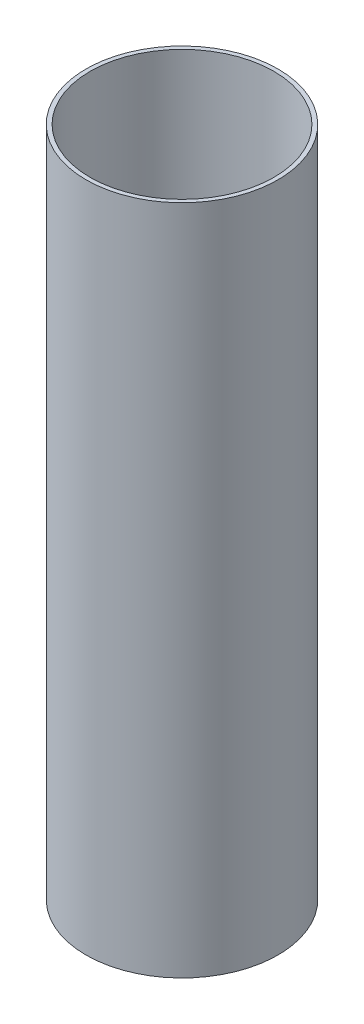
ISO-10303-21;
HEADER;
FILE_DESCRIPTION(('STEP AP214'),'2;1');
FILE_NAME('part.step','',(''),(''),'','','');
FILE_SCHEMA(('AUTOMOTIVE_DESIGN { 1 0 10303 214 1 1 1 1 }'));
ENDSEC;
DATA;
#1=APPLICATION_CONTEXT('core data for automotive mechanical design processes');
#2=APPLICATION_PROTOCOL_DEFINITION('international standard','automotive_design',2000,#1);
#3=PRODUCT_CONTEXT('',#1,'mechanical');
#4=PRODUCT('Part','Part','',(#3));
#5=PRODUCT_RELATED_PRODUCT_CATEGORY('part','',(#4));
#6=PRODUCT_DEFINITION_FORMATION('','',#4);
#7=PRODUCT_DEFINITION_CONTEXT('part definition',#1,'design');
#8=PRODUCT_DEFINITION('design','',#6,#7);
#9=PRODUCT_DEFINITION_SHAPE('','',#8);
#10=(LENGTH_UNIT() NAMED_UNIT(*) SI_UNIT(.MILLI.,.METRE.));
#11=(NAMED_UNIT(*) PLANE_ANGLE_UNIT() SI_UNIT($,.RADIAN.));
#12=(NAMED_UNIT(*) SI_UNIT($,.STERADIAN.) SOLID_ANGLE_UNIT());
#13=UNCERTAINTY_MEASURE_WITH_UNIT(LENGTH_MEASURE(1.E-05),#10,'distance_accuracy_value','');
#14=(GEOMETRIC_REPRESENTATION_CONTEXT(3) GLOBAL_UNCERTAINTY_ASSIGNED_CONTEXT((#13)) GLOBAL_UNIT_ASSIGNED_CONTEXT((#10,
#11,#12)) REPRESENTATION_CONTEXT('',''));
#15=CARTESIAN_POINT('',(0.,0.,0.));
#16=DIRECTION('',(0.,0.,1.));
#17=DIRECTION('',(1.,0.,0.));
#18=AXIS2_PLACEMENT_3D('',#15,#16,#17);
#19=CARTESIAN_POINT('',(0.,453.,0.));
#20=DIRECTION('',(0.,1.,0.));
#21=DIRECTION('',(0.,0.,1.));
#22=AXIS2_PLACEMENT_3D('',#19,#20,#21);
#23=PLANE('',#22);
#24=CARTESIAN_POINT('',(0.,453.,0.));
#25=DIRECTION('',(0.,1.,0.));
#26=DIRECTION('',(0.,0.,1.));
#27=AXIS2_PLACEMENT_3D('',#24,#25,#26);
#28=CIRCLE('',#27,64.775);
#29=CARTESIAN_POINT('',(0.,453.,-64.7750000000003));
#30=VERTEX_POINT('',#29);
#31=EDGE_CURVE('E10',#30,#30,#28,.T.);
#32=ORIENTED_EDGE('',*,*,#31,.T.);
#33=EDGE_LOOP('',(#32));
#34=FACE_BOUND('',#33,.T.);
#35=CARTESIAN_POINT('',(0.,453.,0.));
#36=DIRECTION('',(0.,1.,0.));
#37=DIRECTION('',(0.,0.,1.));
#38=AXIS2_PLACEMENT_3D('',#35,#36,#37);
#39=CIRCLE('',#38,62.);
#40=CARTESIAN_POINT('',(0.,453.,-62.0000000000003));
#41=VERTEX_POINT('',#40);
#42=EDGE_CURVE('E57',#41,#41,#39,.T.);
#43=ORIENTED_EDGE('',*,*,#42,.F.);
#44=EDGE_LOOP('',(#43));
#45=FACE_BOUND('',#44,.T.);
#46=ADVANCED_FACE('F43',(#34,#45),#23,.T.);
#47=CARTESIAN_POINT('',(0.,0.,0.));
#48=DIRECTION('',(0.,1.,0.));
#49=DIRECTION('',(0.,0.,1.));
#50=AXIS2_PLACEMENT_3D('',#47,#48,#49);
#51=PLANE('',#50);
#52=CARTESIAN_POINT('',(0.,0.,0.));
#53=DIRECTION('',(0.,1.,0.));
#54=DIRECTION('',(0.,0.,1.));
#55=AXIS2_PLACEMENT_3D('',#52,#53,#54);
#56=CIRCLE('',#55,64.775);
#57=CARTESIAN_POINT('',(0.,0.,-64.7750000000003));
#58=VERTEX_POINT('',#57);
#59=EDGE_CURVE('E47',#58,#58,#56,.T.);
#60=ORIENTED_EDGE('',*,*,#59,.F.);
#61=EDGE_LOOP('',(#60));
#62=FACE_BOUND('',#61,.T.);
#63=CARTESIAN_POINT('',(0.,0.,0.));
#64=DIRECTION('',(0.,1.,0.));
#65=DIRECTION('',(0.,0.,1.));
#66=AXIS2_PLACEMENT_3D('',#63,#64,#65);
#67=CIRCLE('',#66,62.);
#68=CARTESIAN_POINT('',(0.,0.,-62.0000000000003));
#69=VERTEX_POINT('',#68);
#70=EDGE_CURVE('E59',#69,#69,#67,.T.);
#71=ORIENTED_EDGE('',*,*,#70,.T.);
#72=EDGE_LOOP('',(#71));
#73=FACE_BOUND('',#72,.T.);
#74=ADVANCED_FACE('F72',(#62,#73),#51,.F.);
#75=CARTESIAN_POINT('',(0.,453.,0.));
#76=DIRECTION('',(0.,-1.,0.));
#77=DIRECTION('',(0.,0.,-1.));
#78=AXIS2_PLACEMENT_3D('',#75,#76,#77);
#79=CYLINDRICAL_SURFACE('',#78,64.775);
#80=CARTESIAN_POINT('',(0.,453.,-64.7750000000003));
#81=CARTESIAN_POINT('',(0.,448.28125,-64.7750000000003));
#82=CARTESIAN_POINT('',(0.,443.5625,-64.7750000000003));
#83=CARTESIAN_POINT('',(0.,434.125,-64.7750000000003));
#84=CARTESIAN_POINT('',(0.,429.40625,-64.7750000000003));
#85=CARTESIAN_POINT('',(0.,419.96875,-64.7750000000003));
#86=CARTESIAN_POINT('',(0.,415.25,-64.7750000000003));
#87=CARTESIAN_POINT('',(0.,405.8125,-64.7750000000003));
#88=CARTESIAN_POINT('',(0.,401.09375,-64.7750000000003));
#89=CARTESIAN_POINT('',(0.,391.65625,-64.7750000000003));
#90=CARTESIAN_POINT('',(0.,386.9375,-64.7750000000003));
#91=CARTESIAN_POINT('',(0.,377.5,-64.7750000000003));
#92=CARTESIAN_POINT('',(0.,372.78125,-64.7750000000003));
#93=CARTESIAN_POINT('',(0.,363.34375,-64.7750000000003));
#94=CARTESIAN_POINT('',(0.,358.625,-64.7750000000003));
#95=CARTESIAN_POINT('',(0.,349.1875,-64.7750000000003));
#96=CARTESIAN_POINT('',(0.,344.46875,-64.7750000000003));
#97=CARTESIAN_POINT('',(0.,335.03125,-64.7750000000003));
#98=CARTESIAN_POINT('',(0.,330.3125,-64.7750000000003));
#99=CARTESIAN_POINT('',(0.,320.875,-64.7750000000003));
#100=CARTESIAN_POINT('',(0.,316.15625,-64.7750000000003));
#101=CARTESIAN_POINT('',(0.,306.71875,-64.7750000000003));
#102=CARTESIAN_POINT('',(0.,302.,-64.7750000000003));
#103=CARTESIAN_POINT('',(0.,292.5625,-64.7750000000003));
#104=CARTESIAN_POINT('',(0.,287.84375,-64.7750000000003));
#105=CARTESIAN_POINT('',(0.,278.40625,-64.7750000000003));
#106=CARTESIAN_POINT('',(0.,273.6875,-64.7750000000003));
#107=CARTESIAN_POINT('',(0.,264.25,-64.7750000000003));
#108=CARTESIAN_POINT('',(0.,259.53125,-64.7750000000003));
#109=CARTESIAN_POINT('',(0.,250.09375,-64.7750000000003));
#110=CARTESIAN_POINT('',(0.,245.375,-64.7750000000003));
#111=CARTESIAN_POINT('',(0.,235.9375,-64.7750000000003));
#112=CARTESIAN_POINT('',(0.,231.21875,-64.7750000000003));
#113=CARTESIAN_POINT('',(0.,221.78125,-64.7750000000003));
#114=CARTESIAN_POINT('',(0.,217.0625,-64.7750000000003));
#115=CARTESIAN_POINT('',(0.,207.625,-64.7750000000003));
#116=CARTESIAN_POINT('',(0.,202.90625,-64.7750000000003));
#117=CARTESIAN_POINT('',(0.,193.46875,-64.7750000000003));
#118=CARTESIAN_POINT('',(0.,188.75,-64.7750000000003));
#119=CARTESIAN_POINT('',(0.,179.3125,-64.7750000000003));
#120=CARTESIAN_POINT('',(0.,174.59375,-64.7750000000003));
#121=CARTESIAN_POINT('',(0.,165.15625,-64.7750000000003));
#122=CARTESIAN_POINT('',(0.,160.4375,-64.7750000000003));
#123=CARTESIAN_POINT('',(0.,151.,-64.7750000000003));
#124=CARTESIAN_POINT('',(0.,146.28125,-64.7750000000003));
#125=CARTESIAN_POINT('',(0.,136.84375,-64.7750000000003));
#126=CARTESIAN_POINT('',(0.,132.125,-64.7750000000003));
#127=CARTESIAN_POINT('',(0.,122.6875,-64.7750000000003));
#128=CARTESIAN_POINT('',(0.,117.96875,-64.7750000000003));
#129=CARTESIAN_POINT('',(0.,108.53125,-64.7750000000003));
#130=CARTESIAN_POINT('',(0.,103.8125,-64.7750000000003));
#131=CARTESIAN_POINT('',(0.,94.375,-64.7750000000003));
#132=CARTESIAN_POINT('',(0.,89.65625,-64.7750000000003));
#133=CARTESIAN_POINT('',(0.,80.21875,-64.7750000000003));
#134=CARTESIAN_POINT('',(0.,75.5,-64.7750000000003));
#135=CARTESIAN_POINT('',(0.,66.0625,-64.7750000000003));
#136=CARTESIAN_POINT('',(0.,61.34375,-64.7750000000003));
#137=CARTESIAN_POINT('',(0.,51.90625,-64.7750000000003));
#138=CARTESIAN_POINT('',(0.,47.1875,-64.7750000000003));
#139=CARTESIAN_POINT('',(0.,37.75,-64.7750000000003));
#140=CARTESIAN_POINT('',(0.,33.03125,-64.7750000000003));
#141=CARTESIAN_POINT('',(0.,23.59375,-64.7750000000003));
#142=CARTESIAN_POINT('',(0.,18.875,-64.7750000000003));
#143=CARTESIAN_POINT('',(0.,9.43749999999999,-64.7750000000003));
#144=CARTESIAN_POINT('',(0.,4.71874999999999,-64.7750000000003));
#145=CARTESIAN_POINT('',(0.,0.,-64.7750000000003));
#146=B_SPLINE_CURVE_WITH_KNOTS('',3,(#80,#81,#82,#83,#84,#85,#86,#87,#88,#89,#90,#91,#92,#93,
#94,#95,#96,#97,#98,#99,#100,#101,#102,#103,#104,#105,#106,#107,#108,#109,#110,#111,#112,#113,
#114,#115,#116,#117,#118,#119,#120,#121,#122,#123,#124,#125,#126,#127,#128,#129,#130,#131,#132,
#133,#134,#135,#136,#137,#138,#139,#140,#141,#142,#143,#144,#145),.UNSPECIFIED.,.F.,.F.,(4,2,2,
2,2,2,2,2,2,2,2,2,2,2,2,2,2,2,2,2,2,2,2,2,2,2,2,2,2,2,2,2,4),(0.,14.15625,28.3125,42.46875,
56.625,70.78125,84.9375000000001,99.09375,113.25,127.40625,141.5625,155.71875,169.875,184.03125,
198.1875,212.34375,226.5,240.65625,254.8125,268.96875,283.125,297.28125,311.4375,325.59375,
339.75,353.90625,368.0625,382.21875,396.375,410.53125,424.6875,438.84375,453.),.UNSPECIFIED.);
#147=EDGE_CURVE('BSEAM45',#30,#58,#146,.T.);
#148=ORIENTED_EDGE('',*,*,#31,.F.);
#149=ORIENTED_EDGE('',*,*,#59,.T.);
#150=ORIENTED_EDGE('',*,*,#147,.T.);
#151=ORIENTED_EDGE('',*,*,#147,.F.);
#152=EDGE_LOOP('',(#148,#150,#149,#151));
#153=FACE_BOUND('',#152,.T.);
#154=ADVANCED_FACE('F45',(#153),#79,.T.);
#155=CARTESIAN_POINT('',(0.,453.,0.));
#156=DIRECTION('',(0.,-1.,0.));
#157=DIRECTION('',(0.,0.,-1.));
#158=AXIS2_PLACEMENT_3D('',#155,#156,#157);
#159=CYLINDRICAL_SURFACE('',#158,62.);
#160=CARTESIAN_POINT('',(0.,453.,-62.0000000000003));
#161=CARTESIAN_POINT('',(0.,448.28125,-62.0000000000003));
#162=CARTESIAN_POINT('',(0.,443.5625,-62.0000000000003));
#163=CARTESIAN_POINT('',(0.,434.125,-62.0000000000003));
#164=CARTESIAN_POINT('',(0.,429.40625,-62.0000000000003));
#165=CARTESIAN_POINT('',(0.,419.96875,-62.0000000000003));
#166=CARTESIAN_POINT('',(0.,415.25,-62.0000000000003));
#167=CARTESIAN_POINT('',(0.,405.8125,-62.0000000000003));
#168=CARTESIAN_POINT('',(0.,401.09375,-62.0000000000003));
#169=CARTESIAN_POINT('',(0.,391.65625,-62.0000000000003));
#170=CARTESIAN_POINT('',(0.,386.9375,-62.0000000000003));
#171=CARTESIAN_POINT('',(0.,377.5,-62.0000000000003));
#172=CARTESIAN_POINT('',(0.,372.78125,-62.0000000000003));
#173=CARTESIAN_POINT('',(0.,363.34375,-62.0000000000003));
#174=CARTESIAN_POINT('',(0.,358.625,-62.0000000000003));
#175=CARTESIAN_POINT('',(0.,349.1875,-62.0000000000003));
#176=CARTESIAN_POINT('',(0.,344.46875,-62.0000000000003));
#177=CARTESIAN_POINT('',(0.,335.03125,-62.0000000000003));
#178=CARTESIAN_POINT('',(0.,330.3125,-62.0000000000003));
#179=CARTESIAN_POINT('',(0.,320.875,-62.0000000000003));
#180=CARTESIAN_POINT('',(0.,316.15625,-62.0000000000003));
#181=CARTESIAN_POINT('',(0.,306.71875,-62.0000000000003));
#182=CARTESIAN_POINT('',(0.,302.,-62.0000000000003));
#183=CARTESIAN_POINT('',(0.,292.5625,-62.0000000000003));
#184=CARTESIAN_POINT('',(0.,287.84375,-62.0000000000003));
#185=CARTESIAN_POINT('',(0.,278.40625,-62.0000000000003));
#186=CARTESIAN_POINT('',(0.,273.6875,-62.0000000000003));
#187=CARTESIAN_POINT('',(0.,264.25,-62.0000000000003));
#188=CARTESIAN_POINT('',(0.,259.53125,-62.0000000000003));
#189=CARTESIAN_POINT('',(0.,250.09375,-62.0000000000003));
#190=CARTESIAN_POINT('',(0.,245.375,-62.0000000000003));
#191=CARTESIAN_POINT('',(0.,235.9375,-62.0000000000003));
#192=CARTESIAN_POINT('',(0.,231.21875,-62.0000000000003));
#193=CARTESIAN_POINT('',(0.,221.78125,-62.0000000000003));
#194=CARTESIAN_POINT('',(0.,217.0625,-62.0000000000003));
#195=CARTESIAN_POINT('',(0.,207.625,-62.0000000000003));
#196=CARTESIAN_POINT('',(0.,202.90625,-62.0000000000003));
#197=CARTESIAN_POINT('',(0.,193.46875,-62.0000000000003));
#198=CARTESIAN_POINT('',(0.,188.75,-62.0000000000003));
#199=CARTESIAN_POINT('',(0.,179.3125,-62.0000000000003));
#200=CARTESIAN_POINT('',(0.,174.59375,-62.0000000000003));
#201=CARTESIAN_POINT('',(0.,165.15625,-62.0000000000003));
#202=CARTESIAN_POINT('',(0.,160.4375,-62.0000000000003));
#203=CARTESIAN_POINT('',(0.,151.,-62.0000000000003));
#204=CARTESIAN_POINT('',(0.,146.28125,-62.0000000000003));
#205=CARTESIAN_POINT('',(0.,136.84375,-62.0000000000003));
#206=CARTESIAN_POINT('',(0.,132.125,-62.0000000000003));
#207=CARTESIAN_POINT('',(0.,122.6875,-62.0000000000003));
#208=CARTESIAN_POINT('',(0.,117.96875,-62.0000000000003));
#209=CARTESIAN_POINT('',(0.,108.53125,-62.0000000000003));
#210=CARTESIAN_POINT('',(0.,103.8125,-62.0000000000003));
#211=CARTESIAN_POINT('',(0.,94.375,-62.0000000000003));
#212=CARTESIAN_POINT('',(0.,89.65625,-62.0000000000003));
#213=CARTESIAN_POINT('',(0.,80.21875,-62.0000000000003));
#214=CARTESIAN_POINT('',(0.,75.5,-62.0000000000003));
#215=CARTESIAN_POINT('',(0.,66.0625,-62.0000000000003));
#216=CARTESIAN_POINT('',(0.,61.34375,-62.0000000000003));
#217=CARTESIAN_POINT('',(0.,51.90625,-62.0000000000003));
#218=CARTESIAN_POINT('',(0.,47.1875,-62.0000000000003));
#219=CARTESIAN_POINT('',(0.,37.75,-62.0000000000003));
#220=CARTESIAN_POINT('',(0.,33.03125,-62.0000000000003));
#221=CARTESIAN_POINT('',(0.,23.59375,-62.0000000000003));
#222=CARTESIAN_POINT('',(0.,18.875,-62.0000000000003));
#223=CARTESIAN_POINT('',(0.,9.43749999999999,-62.0000000000003));
#224=CARTESIAN_POINT('',(0.,4.71874999999999,-62.0000000000003));
#225=CARTESIAN_POINT('',(0.,0.,-62.0000000000003));
#226=B_SPLINE_CURVE_WITH_KNOTS('',3,(#160,#161,#162,#163,#164,#165,#166,#167,#168,#169,#170,
#171,#172,#173,#174,#175,#176,#177,#178,#179,#180,#181,#182,#183,#184,#185,#186,#187,#188,#189,
#190,#191,#192,#193,#194,#195,#196,#197,#198,#199,#200,#201,#202,#203,#204,#205,#206,#207,#208,
#209,#210,#211,#212,#213,#214,#215,#216,#217,#218,#219,#220,#221,#222,#223,#224,#225),
.UNSPECIFIED.,.F.,.F.,(4,2,2,2,2,2,2,2,2,2,2,2,2,2,2,2,2,2,2,2,2,2,2,2,2,2,2,2,2,2,2,2,4),(0.,
14.15625,28.3125,42.46875,56.625,70.78125,84.9375000000001,99.09375,113.25,127.40625,141.5625,
155.71875,169.875,184.03125,198.1875,212.34375,226.5,240.65625,254.8125,268.96875,283.125,
297.28125,311.4375,325.59375,339.75,353.90625,368.0625,382.21875,396.375,410.53125,424.6875,
438.84375,453.),.UNSPECIFIED.);
#227=EDGE_CURVE('BSEAM68',#41,#69,#226,.T.);
#228=ORIENTED_EDGE('',*,*,#42,.T.);
#229=ORIENTED_EDGE('',*,*,#70,.F.);
#230=ORIENTED_EDGE('',*,*,#227,.T.);
#231=ORIENTED_EDGE('',*,*,#227,.F.);
#232=EDGE_LOOP('',(#228,#230,#229,#231));
#233=FACE_BOUND('',#232,.T.);
#234=ADVANCED_FACE('F68',(#233),#159,.F.);
#235=CLOSED_SHELL('',(#46,#74,#154,#234));
#236=MANIFOLD_SOLID_BREP('B2',#235);
#237=ADVANCED_BREP_SHAPE_REPRESENTATION('',(#18,#236),#14);
#238=SHAPE_DEFINITION_REPRESENTATION(#9,#237);
ENDSEC;
END-ISO-10303-21;
